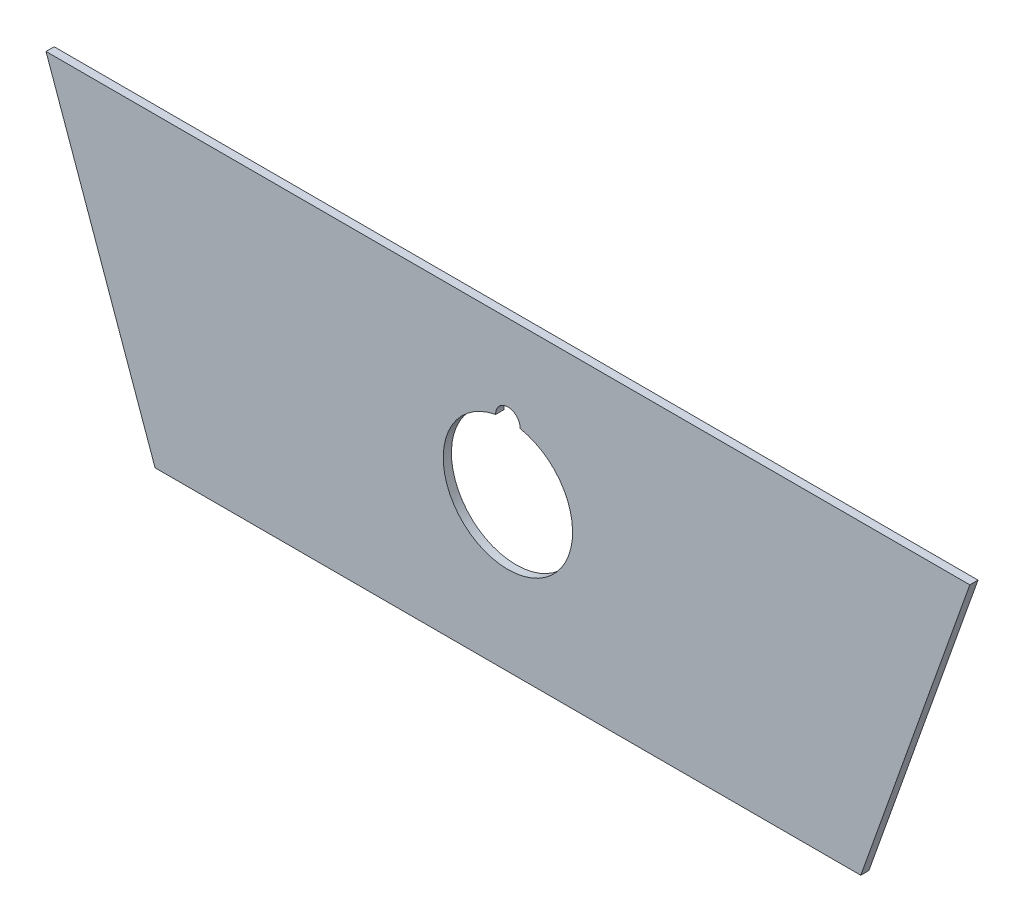
ISO-10303-21;
HEADER;
FILE_DESCRIPTION(('STEP AP214'),'2;1');
FILE_NAME('part.step','',(''),(''),'','','');
FILE_SCHEMA(('AUTOMOTIVE_DESIGN { 1 0 10303 214 1 1 1 1 }'));
ENDSEC;
DATA;
#1=APPLICATION_CONTEXT('core data for automotive mechanical design processes');
#2=APPLICATION_PROTOCOL_DEFINITION('international standard','automotive_design',2000,#1);
#3=PRODUCT_CONTEXT('',#1,'mechanical');
#4=PRODUCT('Part','Part','',(#3));
#5=PRODUCT_RELATED_PRODUCT_CATEGORY('part','',(#4));
#6=PRODUCT_DEFINITION_FORMATION('','',#4);
#7=PRODUCT_DEFINITION_CONTEXT('part definition',#1,'design');
#8=PRODUCT_DEFINITION('design','',#6,#7);
#9=PRODUCT_DEFINITION_SHAPE('','',#8);
#10=(LENGTH_UNIT() NAMED_UNIT(*) SI_UNIT(.MILLI.,.METRE.));
#11=(NAMED_UNIT(*) PLANE_ANGLE_UNIT() SI_UNIT($,.RADIAN.));
#12=(NAMED_UNIT(*) SI_UNIT($,.STERADIAN.) SOLID_ANGLE_UNIT());
#13=UNCERTAINTY_MEASURE_WITH_UNIT(LENGTH_MEASURE(1.E-05),#10,'distance_accuracy_value','');
#14=(GEOMETRIC_REPRESENTATION_CONTEXT(3) GLOBAL_UNCERTAINTY_ASSIGNED_CONTEXT((#13)) GLOBAL_UNIT_ASSIGNED_CONTEXT((#10,
#11,#12)) REPRESENTATION_CONTEXT('',''));
#15=CARTESIAN_POINT('',(0.,0.,0.));
#16=DIRECTION('',(0.,0.,1.));
#17=DIRECTION('',(1.,0.,0.));
#18=AXIS2_PLACEMENT_3D('',#15,#16,#17);
#19=CARTESIAN_POINT('',(-57.5,-19.05,1.016));
#20=DIRECTION('',(0.,1.,0.));
#21=DIRECTION('',(0.,0.,1.));
#22=AXIS2_PLACEMENT_3D('',#19,#20,#21);
#23=PLANE('',#22);
#24=DIRECTION('',(0.,0.,-1.));
#25=VECTOR('',#24,1.);
#26=CARTESIAN_POINT('',(43.9219599212296,-19.05,1.016));
#27=LINE('',#26,#25);
#28=CARTESIAN_POINT('',(43.9219599212296,-19.05,1.016));
#29=VERTEX_POINT('',#28);
#30=CARTESIAN_POINT('',(43.9219599212296,-19.05,0.));
#31=VERTEX_POINT('',#30);
#32=EDGE_CURVE('E124',#29,#31,#27,.T.);
#33=ORIENTED_EDGE('',*,*,#32,.F.);
#34=DIRECTION('',(1.,0.,0.));
#35=VECTOR('',#34,1.);
#36=CARTESIAN_POINT('',(-57.5,-19.05,1.016));
#37=LINE('',#36,#35);
#38=CARTESIAN_POINT('',(-43.9219599212296,-19.05,1.016));
#39=VERTEX_POINT('',#38);
#40=EDGE_CURVE('E122',#39,#29,#37,.T.);
#41=ORIENTED_EDGE('',*,*,#40,.F.);
#42=DIRECTION('',(0.,0.,-1.));
#43=VECTOR('',#42,1.);
#44=CARTESIAN_POINT('',(-43.9219599212296,-19.05,1.016));
#45=LINE('',#44,#43);
#46=CARTESIAN_POINT('',(-43.9219599212296,-19.05,0.));
#47=VERTEX_POINT('',#46);
#48=EDGE_CURVE('E153',#39,#47,#45,.T.);
#49=ORIENTED_EDGE('',*,*,#48,.T.);
#50=DIRECTION('',(1.,0.,0.));
#51=VECTOR('',#50,1.);
#52=CARTESIAN_POINT('',(-57.5,-19.05,0.));
#53=LINE('',#52,#51);
#54=EDGE_CURVE('E127',#47,#31,#53,.T.);
#55=ORIENTED_EDGE('',*,*,#54,.T.);
#56=EDGE_LOOP('',(#33,#41,#49,#55));
#57=FACE_BOUND('',#56,.T.);
#58=ADVANCED_FACE('F41',(#57),#23,.F.);
#59=CARTESIAN_POINT('',(0.,0.,1.016));
#60=DIRECTION('',(0.,0.,-1.));
#61=DIRECTION('',(-1.,0.,0.));
#62=AXIS2_PLACEMENT_3D('',#59,#60,#61);
#63=PLANE('',#62);
#64=CARTESIAN_POINT('',(0.,7.950000102,1.016));
#65=DIRECTION('',(0.,0.,1.));
#66=DIRECTION('',(1.,0.,0.));
#67=AXIS2_PLACEMENT_3D('',#64,#65,#66);
#68=CIRCLE('',#67,1.5250033);
#69=CARTESIAN_POINT('',(1.5243202694417,7.90436260447793,1.016));
#70=VERTEX_POINT('',#69);
#71=CARTESIAN_POINT('',(-1.5243202694417,7.90436260447793,1.016));
#72=VERTEX_POINT('',#71);
#73=EDGE_CURVE('E159',#70,#72,#68,.T.);
#74=ORIENTED_EDGE('',*,*,#73,.F.);
#75=CARTESIAN_POINT('',(0.,0.,1.016));
#76=DIRECTION('',(0.,0.,1.));
#77=DIRECTION('',(1.,0.,0.));
#78=AXIS2_PLACEMENT_3D('',#75,#76,#77);
#79=CIRCLE('',#78,8.050000029);
#80=EDGE_CURVE('E162',#72,#70,#79,.T.);
#81=ORIENTED_EDGE('',*,*,#80,.F.);
#82=EDGE_LOOP('',(#74,#81));
#83=FACE_BOUND('',#82,.T.);
#84=DIRECTION('',(-0.335698188316106,-0.941969599488903,0.));
#85=VECTOR('',#84,1.);
#86=CARTESIAN_POINT('',(57.5,19.05,1.016));
#87=LINE('',#86,#85);
#88=CARTESIAN_POINT('',(57.5,19.05,1.016));
#89=VERTEX_POINT('',#88);
#90=EDGE_CURVE('E106',#89,#29,#87,.T.);
#91=ORIENTED_EDGE('',*,*,#90,.F.);
#92=DIRECTION('',(-1.,0.,0.));
#93=VECTOR('',#92,1.);
#94=CARTESIAN_POINT('',(-57.5,19.05,1.016));
#95=LINE('',#94,#93);
#96=CARTESIAN_POINT('',(-57.5,19.05,1.016));
#97=VERTEX_POINT('',#96);
#98=EDGE_CURVE('E119',#89,#97,#95,.T.);
#99=ORIENTED_EDGE('',*,*,#98,.T.);
#100=DIRECTION('',(-0.335698188316106,0.941969599488903,0.));
#101=VECTOR('',#100,1.);
#102=CARTESIAN_POINT('',(-57.5,19.05,1.016));
#103=LINE('',#102,#101);
#104=EDGE_CURVE('E147',#39,#97,#103,.T.);
#105=ORIENTED_EDGE('',*,*,#104,.F.);
#106=ORIENTED_EDGE('',*,*,#40,.T.);
#107=EDGE_LOOP('',(#91,#99,#105,#106));
#108=FACE_BOUND('',#107,.T.);
#109=ADVANCED_FACE('F117',(#83,#108),#63,.F.);
#110=CARTESIAN_POINT('',(0.,0.,0.));
#111=DIRECTION('',(0.,0.,-1.));
#112=DIRECTION('',(-1.,0.,0.));
#113=AXIS2_PLACEMENT_3D('',#110,#111,#112);
#114=PLANE('',#113);
#115=CARTESIAN_POINT('',(0.,0.,0.));
#116=DIRECTION('',(0.,0.,1.));
#117=DIRECTION('',(1.,0.,0.));
#118=AXIS2_PLACEMENT_3D('',#115,#116,#117);
#119=CIRCLE('',#118,8.050000029);
#120=CARTESIAN_POINT('',(-1.5243202694417,7.90436260447793,0.));
#121=VERTEX_POINT('',#120);
#122=CARTESIAN_POINT('',(1.5243202694417,7.90436260447793,0.));
#123=VERTEX_POINT('',#122);
#124=EDGE_CURVE('E163',#121,#123,#119,.T.);
#125=ORIENTED_EDGE('',*,*,#124,.T.);
#126=CARTESIAN_POINT('',(0.,7.950000102,0.));
#127=DIRECTION('',(0.,0.,1.));
#128=DIRECTION('',(1.,0.,0.));
#129=AXIS2_PLACEMENT_3D('',#126,#127,#128);
#130=CIRCLE('',#129,1.5250033);
#131=EDGE_CURVE('E70',#123,#121,#130,.T.);
#132=ORIENTED_EDGE('',*,*,#131,.T.);
#133=EDGE_LOOP('',(#125,#132));
#134=FACE_BOUND('',#133,.T.);
#135=DIRECTION('',(-1.,0.,0.));
#136=VECTOR('',#135,1.);
#137=CARTESIAN_POINT('',(-57.5,19.05,0.));
#138=LINE('',#137,#136);
#139=CARTESIAN_POINT('',(57.5,19.05,0.));
#140=VERTEX_POINT('',#139);
#141=CARTESIAN_POINT('',(-57.5,19.05,0.));
#142=VERTEX_POINT('',#141);
#143=EDGE_CURVE('E134',#140,#142,#138,.T.);
#144=ORIENTED_EDGE('',*,*,#143,.F.);
#145=DIRECTION('',(-0.335698188316106,-0.941969599488903,0.));
#146=VECTOR('',#145,1.);
#147=CARTESIAN_POINT('',(57.5,19.05,0.));
#148=LINE('',#147,#146);
#149=EDGE_CURVE('E109',#140,#31,#148,.T.);
#150=ORIENTED_EDGE('',*,*,#149,.T.);
#151=ORIENTED_EDGE('',*,*,#54,.F.);
#152=DIRECTION('',(-0.335698188316106,0.941969599488903,0.));
#153=VECTOR('',#152,1.);
#154=CARTESIAN_POINT('',(-57.5,19.05,0.));
#155=LINE('',#154,#153);
#156=EDGE_CURVE('E145',#47,#142,#155,.T.);
#157=ORIENTED_EDGE('',*,*,#156,.T.);
#158=EDGE_LOOP('',(#144,#150,#151,#157));
#159=FACE_BOUND('',#158,.T.);
#160=ADVANCED_FACE('F150',(#134,#159),#114,.T.);
#161=CARTESIAN_POINT('',(-57.5,19.05,1.016));
#162=DIRECTION('',(0.,-1.,0.));
#163=DIRECTION('',(0.,0.,-1.));
#164=AXIS2_PLACEMENT_3D('',#161,#162,#163);
#165=PLANE('',#164);
#166=ORIENTED_EDGE('',*,*,#143,.T.);
#167=DIRECTION('',(0.,0.,-1.));
#168=VECTOR('',#167,1.);
#169=CARTESIAN_POINT('',(-57.5,19.05,1.016));
#170=LINE('',#169,#168);
#171=EDGE_CURVE('E50',#97,#142,#170,.T.);
#172=ORIENTED_EDGE('',*,*,#171,.F.);
#173=ORIENTED_EDGE('',*,*,#98,.F.);
#174=DIRECTION('',(0.,0.,-1.));
#175=VECTOR('',#174,1.);
#176=CARTESIAN_POINT('',(57.5,19.05,1.016));
#177=LINE('',#176,#175);
#178=EDGE_CURVE('E11',#89,#140,#177,.T.);
#179=ORIENTED_EDGE('',*,*,#178,.T.);
#180=EDGE_LOOP('',(#166,#172,#173,#179));
#181=FACE_BOUND('',#180,.T.);
#182=ADVANCED_FACE('F43',(#181),#165,.F.);
#183=CARTESIAN_POINT('',(0.,7.950000102,1.016));
#184=DIRECTION('',(0.,0.,-1.));
#185=DIRECTION('',(-1.,0.,0.));
#186=AXIS2_PLACEMENT_3D('',#183,#184,#185);
#187=CYLINDRICAL_SURFACE('',#186,1.5250033);
#188=ORIENTED_EDGE('',*,*,#131,.F.);
#189=DIRECTION('',(0.,0.,-1.));
#190=VECTOR('',#189,1.);
#191=CARTESIAN_POINT('',(1.5243202694417,7.90436260447793,1.016));
#192=LINE('',#191,#190);
#193=EDGE_CURVE('E166',#70,#123,#192,.T.);
#194=ORIENTED_EDGE('',*,*,#193,.F.);
#195=ORIENTED_EDGE('',*,*,#73,.T.);
#196=DIRECTION('',(0.,0.,-1.));
#197=VECTOR('',#196,1.);
#198=CARTESIAN_POINT('',(-1.5243202694417,7.90436260447793,1.016));
#199=LINE('',#198,#197);
#200=EDGE_CURVE('E60',#72,#121,#199,.T.);
#201=ORIENTED_EDGE('',*,*,#200,.T.);
#202=EDGE_LOOP('',(#188,#194,#195,#201));
#203=FACE_BOUND('',#202,.T.);
#204=ADVANCED_FACE('F172',(#203),#187,.F.);
#205=CARTESIAN_POINT('',(0.,0.,1.016));
#206=DIRECTION('',(0.,0.,-1.));
#207=DIRECTION('',(-1.,0.,0.));
#208=AXIS2_PLACEMENT_3D('',#205,#206,#207);
#209=CYLINDRICAL_SURFACE('',#208,8.050000029);
#210=ORIENTED_EDGE('',*,*,#124,.F.);
#211=ORIENTED_EDGE('',*,*,#200,.F.);
#212=ORIENTED_EDGE('',*,*,#80,.T.);
#213=ORIENTED_EDGE('',*,*,#193,.T.);
#214=EDGE_LOOP('',(#210,#211,#212,#213));
#215=FACE_BOUND('',#214,.T.);
#216=ADVANCED_FACE('F176',(#215),#209,.F.);
#217=CARTESIAN_POINT('',(-57.5,19.05,1.016));
#218=DIRECTION('',(-0.941969599488903,-0.335698188316106,0.));
#219=DIRECTION('',(0.335698188316106,-0.941969599488903,0.));
#220=AXIS2_PLACEMENT_3D('',#217,#218,#219);
#221=PLANE('',#220);
#222=ORIENTED_EDGE('',*,*,#156,.F.);
#223=ORIENTED_EDGE('',*,*,#48,.F.);
#224=ORIENTED_EDGE('',*,*,#104,.T.);
#225=ORIENTED_EDGE('',*,*,#171,.T.);
#226=EDGE_LOOP('',(#222,#223,#224,#225));
#227=FACE_BOUND('',#226,.T.);
#228=ADVANCED_FACE('F144',(#227),#221,.T.);
#229=CARTESIAN_POINT('',(57.5,19.05,1.016));
#230=DIRECTION('',(0.941969599488903,-0.335698188316106,0.));
#231=DIRECTION('',(0.335698188316106,0.941969599488903,0.));
#232=AXIS2_PLACEMENT_3D('',#229,#230,#231);
#233=PLANE('',#232);
#234=ORIENTED_EDGE('',*,*,#149,.F.);
#235=ORIENTED_EDGE('',*,*,#178,.F.);
#236=ORIENTED_EDGE('',*,*,#90,.T.);
#237=ORIENTED_EDGE('',*,*,#32,.T.);
#238=EDGE_LOOP('',(#234,#235,#236,#237));
#239=FACE_BOUND('',#238,.T.);
#240=ADVANCED_FACE('F105',(#239),#233,.T.);
#241=CLOSED_SHELL('',(#58,#109,#160,#182,#204,#216,#228,#240));
#242=MANIFOLD_SOLID_BREP('B2',#241);
#243=ADVANCED_BREP_SHAPE_REPRESENTATION('',(#18,#242),#14);
#244=SHAPE_DEFINITION_REPRESENTATION(#9,#243);
ENDSEC;
END-ISO-10303-21;
